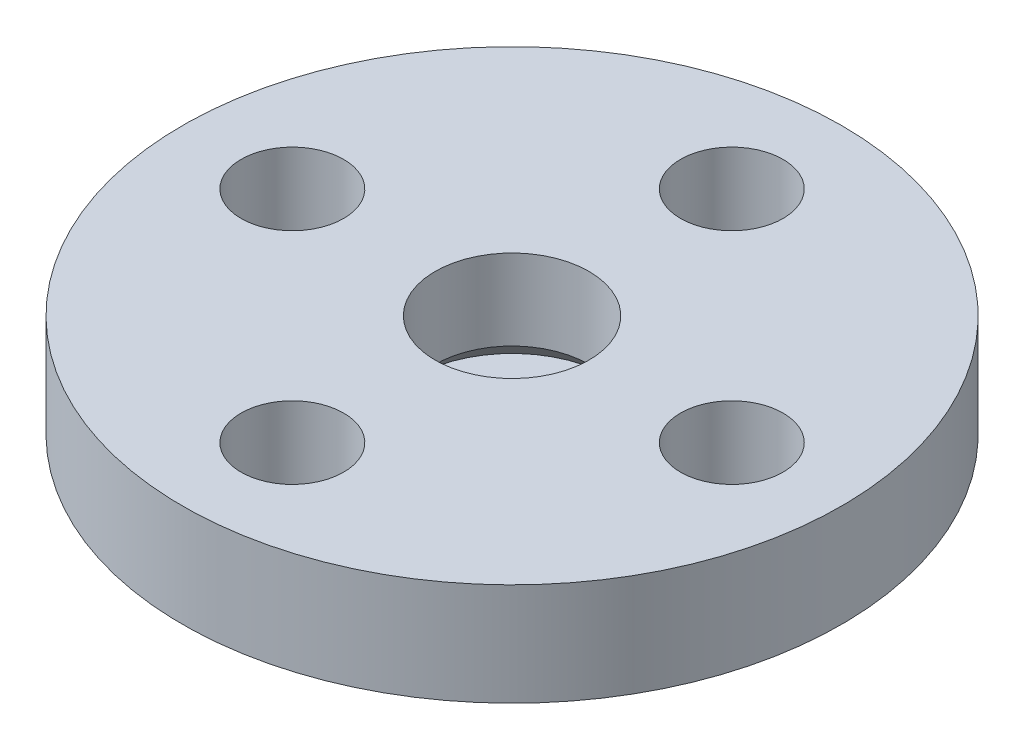
ISO-10303-21;
HEADER;
FILE_DESCRIPTION(('STEP AP214'),'2;1');
FILE_NAME('part.step','',(''),(''),'','','');
FILE_SCHEMA(('AUTOMOTIVE_DESIGN { 1 0 10303 214 1 1 1 1 }'));
ENDSEC;
DATA;
#1=APPLICATION_CONTEXT('core data for automotive mechanical design processes');
#2=APPLICATION_PROTOCOL_DEFINITION('international standard','automotive_design',2000,#1);
#3=PRODUCT_CONTEXT('',#1,'mechanical');
#4=PRODUCT('Part','Part','',(#3));
#5=PRODUCT_RELATED_PRODUCT_CATEGORY('part','',(#4));
#6=PRODUCT_DEFINITION_FORMATION('','',#4);
#7=PRODUCT_DEFINITION_CONTEXT('part definition',#1,'design');
#8=PRODUCT_DEFINITION('design','',#6,#7);
#9=PRODUCT_DEFINITION_SHAPE('','',#8);
#10=(LENGTH_UNIT() NAMED_UNIT(*) SI_UNIT(.MILLI.,.METRE.));
#11=(NAMED_UNIT(*) PLANE_ANGLE_UNIT() SI_UNIT($,.RADIAN.));
#12=(NAMED_UNIT(*) SI_UNIT($,.STERADIAN.) SOLID_ANGLE_UNIT());
#13=UNCERTAINTY_MEASURE_WITH_UNIT(LENGTH_MEASURE(1.E-05),#10,'distance_accuracy_value','');
#14=(GEOMETRIC_REPRESENTATION_CONTEXT(3) GLOBAL_UNCERTAINTY_ASSIGNED_CONTEXT((#13)) GLOBAL_UNIT_ASSIGNED_CONTEXT((#10,
#11,#12)) REPRESENTATION_CONTEXT('',''));
#15=CARTESIAN_POINT('',(0.,0.,0.));
#16=DIRECTION('',(0.,0.,1.));
#17=DIRECTION('',(1.,0.,0.));
#18=AXIS2_PLACEMENT_3D('',#15,#16,#17);
#19=CARTESIAN_POINT('',(0.,0.,-20.));
#20=DIRECTION('',(0.,-1.,0.));
#21=DIRECTION('',(0.,0.,-1.));
#22=AXIS2_PLACEMENT_3D('',#19,#20,#21);
#23=PLANE('',#22);
#24=CARTESIAN_POINT('',(0.,0.,30.));
#25=DIRECTION('',(0.,1.,0.));
#26=DIRECTION('',(0.,0.,-1.));
#27=AXIS2_PLACEMENT_3D('',#24,#25,#26);
#28=CIRCLE('',#27,6.99999999999999);
#29=CARTESIAN_POINT('',(0.,0.,23.));
#30=VERTEX_POINT('',#29);
#31=EDGE_CURVE('E92',#30,#30,#28,.T.);
#32=ORIENTED_EDGE('',*,*,#31,.T.);
#33=EDGE_LOOP('',(#32));
#34=FACE_BOUND('',#33,.T.);
#35=CARTESIAN_POINT('',(0.,0.,-30.));
#36=DIRECTION('',(0.,1.,0.));
#37=DIRECTION('',(0.,0.,1.));
#38=AXIS2_PLACEMENT_3D('',#35,#36,#37);
#39=CIRCLE('',#38,6.99999999999999);
#40=CARTESIAN_POINT('',(0.,0.,-23.));
#41=VERTEX_POINT('',#40);
#42=EDGE_CURVE('E80',#41,#41,#39,.T.);
#43=ORIENTED_EDGE('',*,*,#42,.T.);
#44=EDGE_LOOP('',(#43));
#45=FACE_BOUND('',#44,.T.);
#46=CARTESIAN_POINT('',(0.,0.,0.));
#47=DIRECTION('',(0.,-1.,0.));
#48=DIRECTION('',(0.,0.,-1.));
#49=AXIS2_PLACEMENT_3D('',#46,#47,#48);
#50=CIRCLE('',#49,45.);
#51=CARTESIAN_POINT('',(0.,0.,-45.));
#52=VERTEX_POINT('',#51);
#53=EDGE_CURVE('E64',#52,#52,#50,.T.);
#54=ORIENTED_EDGE('',*,*,#53,.T.);
#55=EDGE_LOOP('',(#54));
#56=FACE_BOUND('',#55,.T.);
#57=CARTESIAN_POINT('',(0.,0.,0.));
#58=DIRECTION('',(0.,-1.,0.));
#59=DIRECTION('',(0.,0.,-1.));
#60=AXIS2_PLACEMENT_3D('',#57,#58,#59);
#61=CIRCLE('',#60,20.);
#62=CARTESIAN_POINT('',(0.,0.,-20.));
#63=VERTEX_POINT('',#62);
#64=EDGE_CURVE('E61',#63,#63,#61,.T.);
#65=ORIENTED_EDGE('',*,*,#64,.F.);
#66=EDGE_LOOP('',(#65));
#67=FACE_BOUND('',#66,.T.);
#68=CARTESIAN_POINT('',(30.,0.,1.04744440165294E-13));
#69=DIRECTION('',(0.,1.,0.));
#70=DIRECTION('',(-1.,0.,0.));
#71=AXIS2_PLACEMENT_3D('',#68,#69,#70);
#72=CIRCLE('',#71,6.99999999999999);
#73=CARTESIAN_POINT('',(23.,0.,0.));
#74=VERTEX_POINT('',#73);
#75=EDGE_CURVE('E86',#74,#74,#72,.T.);
#76=ORIENTED_EDGE('',*,*,#75,.T.);
#77=EDGE_LOOP('',(#76));
#78=FACE_BOUND('',#77,.T.);
#79=CARTESIAN_POINT('',(-30.,0.,-3.14233320495882E-13));
#80=DIRECTION('',(0.,1.,0.));
#81=DIRECTION('',(1.,0.,0.));
#82=AXIS2_PLACEMENT_3D('',#79,#80,#81);
#83=CIRCLE('',#82,6.99999999999999);
#84=CARTESIAN_POINT('',(-23.,0.,-2.40912212380176E-13));
#85=VERTEX_POINT('',#84);
#86=EDGE_CURVE('E98',#85,#85,#83,.T.);
#87=ORIENTED_EDGE('',*,*,#86,.T.);
#88=EDGE_LOOP('',(#87));
#89=FACE_BOUND('',#88,.T.);
#90=ADVANCED_FACE('F38',(#34,#45,#56,#67,#78,#89),#23,.T.);
#91=CARTESIAN_POINT('',(0.,14.,-45.));
#92=DIRECTION('',(0.,1.,0.));
#93=DIRECTION('',(0.,0.,1.));
#94=AXIS2_PLACEMENT_3D('',#91,#92,#93);
#95=PLANE('',#94);
#96=CARTESIAN_POINT('',(0.,14.,30.));
#97=DIRECTION('',(0.,1.,0.));
#98=DIRECTION('',(0.,0.,-1.));
#99=AXIS2_PLACEMENT_3D('',#96,#97,#98);
#100=CIRCLE('',#99,6.99999999999999);
#101=CARTESIAN_POINT('',(0.,14.,23.));
#102=VERTEX_POINT('',#101);
#103=EDGE_CURVE('E89',#102,#102,#100,.T.);
#104=ORIENTED_EDGE('',*,*,#103,.F.);
#105=EDGE_LOOP('',(#104));
#106=FACE_BOUND('',#105,.T.);
#107=CARTESIAN_POINT('',(0.,14.,-30.));
#108=DIRECTION('',(0.,1.,0.));
#109=DIRECTION('',(0.,0.,1.));
#110=AXIS2_PLACEMENT_3D('',#107,#108,#109);
#111=CIRCLE('',#110,6.99999999999999);
#112=CARTESIAN_POINT('',(0.,14.,-23.));
#113=VERTEX_POINT('',#112);
#114=EDGE_CURVE('E79',#113,#113,#111,.T.);
#115=ORIENTED_EDGE('',*,*,#114,.F.);
#116=EDGE_LOOP('',(#115));
#117=FACE_BOUND('',#116,.T.);
#118=CARTESIAN_POINT('',(0.,14.,0.));
#119=DIRECTION('',(0.,-1.,0.));
#120=DIRECTION('',(0.,0.,-1.));
#121=AXIS2_PLACEMENT_3D('',#118,#119,#120);
#122=CIRCLE('',#121,10.5);
#123=CARTESIAN_POINT('',(0.,14.,-10.5));
#124=VERTEX_POINT('',#123);
#125=EDGE_CURVE('E70',#124,#124,#122,.T.);
#126=ORIENTED_EDGE('',*,*,#125,.T.);
#127=EDGE_LOOP('',(#126));
#128=FACE_BOUND('',#127,.T.);
#129=CARTESIAN_POINT('',(0.,14.,0.));
#130=DIRECTION('',(0.,-1.,0.));
#131=DIRECTION('',(0.,0.,-1.));
#132=AXIS2_PLACEMENT_3D('',#129,#130,#131);
#133=CIRCLE('',#132,45.);
#134=CARTESIAN_POINT('',(0.,14.,-45.));
#135=VERTEX_POINT('',#134);
#136=EDGE_CURVE('E67',#135,#135,#133,.T.);
#137=ORIENTED_EDGE('',*,*,#136,.F.);
#138=EDGE_LOOP('',(#137));
#139=FACE_BOUND('',#138,.T.);
#140=CARTESIAN_POINT('',(30.,14.,1.04744440165294E-13));
#141=DIRECTION('',(0.,1.,0.));
#142=DIRECTION('',(-1.,0.,0.));
#143=AXIS2_PLACEMENT_3D('',#140,#141,#142);
#144=CIRCLE('',#143,6.99999999999999);
#145=CARTESIAN_POINT('',(23.,14.,0.));
#146=VERTEX_POINT('',#145);
#147=EDGE_CURVE('E83',#146,#146,#144,.T.);
#148=ORIENTED_EDGE('',*,*,#147,.F.);
#149=EDGE_LOOP('',(#148));
#150=FACE_BOUND('',#149,.T.);
#151=CARTESIAN_POINT('',(-30.,14.,-3.14233320495882E-13));
#152=DIRECTION('',(0.,1.,0.));
#153=DIRECTION('',(1.,0.,0.));
#154=AXIS2_PLACEMENT_3D('',#151,#152,#153);
#155=CIRCLE('',#154,6.99999999999999);
#156=CARTESIAN_POINT('',(-23.,14.,-2.40912212380176E-13));
#157=VERTEX_POINT('',#156);
#158=EDGE_CURVE('E95',#157,#157,#155,.T.);
#159=ORIENTED_EDGE('',*,*,#158,.F.);
#160=EDGE_LOOP('',(#159));
#161=FACE_BOUND('',#160,.T.);
#162=ADVANCED_FACE('F107',(#106,#117,#128,#139,#150,#161),#95,.T.);
#163=CARTESIAN_POINT('',(0.,0.,-13.5));
#164=DIRECTION('',(0.,1.,0.));
#165=DIRECTION('',(0.,0.,1.));
#166=AXIS2_PLACEMENT_3D('',#163,#164,#165);
#167=PLANE('',#166);
#168=CARTESIAN_POINT('',(0.,0.,0.));
#169=DIRECTION('',(0.,-1.,0.));
#170=DIRECTION('',(0.,0.,-1.));
#171=AXIS2_PLACEMENT_3D('',#168,#169,#170);
#172=CIRCLE('',#171,9.);
#173=CARTESIAN_POINT('',(0.,0.,-9.));
#174=VERTEX_POINT('',#173);
#175=EDGE_CURVE('E10',#174,#174,#172,.T.);
#176=ORIENTED_EDGE('',*,*,#175,.T.);
#177=EDGE_LOOP('',(#176));
#178=FACE_BOUND('',#177,.T.);
#179=CARTESIAN_POINT('',(0.,0.,0.));
#180=DIRECTION('',(0.,-1.,0.));
#181=DIRECTION('',(0.,0.,-1.));
#182=AXIS2_PLACEMENT_3D('',#179,#180,#181);
#183=CIRCLE('',#182,13.5);
#184=CARTESIAN_POINT('',(0.,0.,-13.5));
#185=VERTEX_POINT('',#184);
#186=EDGE_CURVE('E76',#185,#185,#183,.T.);
#187=ORIENTED_EDGE('',*,*,#186,.F.);
#188=EDGE_LOOP('',(#187));
#189=FACE_BOUND('',#188,.T.);
#190=ADVANCED_FACE('F40',(#178,#189),#167,.T.);
#191=CARTESIAN_POINT('',(0.,0.,0.));
#192=DIRECTION('',(0.,-1.,0.));
#193=DIRECTION('',(0.,0.,-1.));
#194=AXIS2_PLACEMENT_3D('',#191,#192,#193);
#195=CYLINDRICAL_SURFACE('',#194,9.);
#196=CARTESIAN_POINT('',(0.,-7.5,0.));
#197=DIRECTION('',(0.,-1.,0.));
#198=DIRECTION('',(0.,0.,-1.));
#199=AXIS2_PLACEMENT_3D('',#196,#197,#198);
#200=CIRCLE('',#199,9.);
#201=CARTESIAN_POINT('',(0.,-7.5,-9.));
#202=VERTEX_POINT('',#201);
#203=EDGE_CURVE('E45',#202,#202,#200,.T.);
#204=ORIENTED_EDGE('',*,*,#203,.T.);
#205=EDGE_LOOP('',(#204));
#206=FACE_BOUND('',#205,.T.);
#207=ORIENTED_EDGE('',*,*,#175,.F.);
#208=EDGE_LOOP('',(#207));
#209=FACE_BOUND('',#208,.T.);
#210=ADVANCED_FACE('F116',(#206,#209),#195,.F.);
#211=CARTESIAN_POINT('',(0.,-7.5,-9.));
#212=DIRECTION('',(0.,-1.,0.));
#213=DIRECTION('',(0.,0.,-1.));
#214=AXIS2_PLACEMENT_3D('',#211,#212,#213);
#215=PLANE('',#214);
#216=CARTESIAN_POINT('',(0.,-7.5,0.));
#217=DIRECTION('',(0.,-1.,0.));
#218=DIRECTION('',(0.,0.,-1.));
#219=AXIS2_PLACEMENT_3D('',#216,#217,#218);
#220=CIRCLE('',#219,12.);
#221=CARTESIAN_POINT('',(0.,-7.5,-12.));
#222=VERTEX_POINT('',#221);
#223=EDGE_CURVE('E49',#222,#222,#220,.T.);
#224=ORIENTED_EDGE('',*,*,#223,.T.);
#225=EDGE_LOOP('',(#224));
#226=FACE_BOUND('',#225,.T.);
#227=ORIENTED_EDGE('',*,*,#203,.F.);
#228=EDGE_LOOP('',(#227));
#229=FACE_BOUND('',#228,.T.);
#230=ADVANCED_FACE('F140',(#226,#229),#215,.T.);
#231=CARTESIAN_POINT('',(0.,0.,0.));
#232=DIRECTION('',(0.,-1.,0.));
#233=DIRECTION('',(0.,0.,-1.));
#234=AXIS2_PLACEMENT_3D('',#231,#232,#233);
#235=CYLINDRICAL_SURFACE('',#234,12.);
#236=CARTESIAN_POINT('',(0.,-12.,0.));
#237=DIRECTION('',(0.,-1.,0.));
#238=DIRECTION('',(0.,0.,-1.));
#239=AXIS2_PLACEMENT_3D('',#236,#237,#238);
#240=CIRCLE('',#239,12.);
#241=CARTESIAN_POINT('',(0.,-12.,-12.));
#242=VERTEX_POINT('',#241);
#243=EDGE_CURVE('E53',#242,#242,#240,.T.);
#244=ORIENTED_EDGE('',*,*,#243,.T.);
#245=EDGE_LOOP('',(#244));
#246=FACE_BOUND('',#245,.T.);
#247=ORIENTED_EDGE('',*,*,#223,.F.);
#248=EDGE_LOOP('',(#247));
#249=FACE_BOUND('',#248,.T.);
#250=ADVANCED_FACE('F136',(#246,#249),#235,.F.);
#251=CARTESIAN_POINT('',(0.,-12.,-12.));
#252=DIRECTION('',(0.,-1.,0.));
#253=DIRECTION('',(0.,0.,-1.));
#254=AXIS2_PLACEMENT_3D('',#251,#252,#253);
#255=PLANE('',#254);
#256=CARTESIAN_POINT('',(0.,-12.,0.));
#257=DIRECTION('',(0.,-1.,0.));
#258=DIRECTION('',(0.,0.,-1.));
#259=AXIS2_PLACEMENT_3D('',#256,#257,#258);
#260=CIRCLE('',#259,20.);
#261=CARTESIAN_POINT('',(0.,-12.,-20.));
#262=VERTEX_POINT('',#261);
#263=EDGE_CURVE('E58',#262,#262,#260,.T.);
#264=ORIENTED_EDGE('',*,*,#263,.T.);
#265=EDGE_LOOP('',(#264));
#266=FACE_BOUND('',#265,.T.);
#267=ORIENTED_EDGE('',*,*,#243,.F.);
#268=EDGE_LOOP('',(#267));
#269=FACE_BOUND('',#268,.T.);
#270=ADVANCED_FACE('F132',(#266,#269),#255,.T.);
#271=CARTESIAN_POINT('',(0.,0.,0.));
#272=DIRECTION('',(0.,-1.,0.));
#273=DIRECTION('',(0.,0.,-1.));
#274=AXIS2_PLACEMENT_3D('',#271,#272,#273);
#275=CYLINDRICAL_SURFACE('',#274,20.);
#276=ORIENTED_EDGE('',*,*,#64,.T.);
#277=EDGE_LOOP('',(#276));
#278=FACE_BOUND('',#277,.T.);
#279=ORIENTED_EDGE('',*,*,#263,.F.);
#280=EDGE_LOOP('',(#279));
#281=FACE_BOUND('',#280,.T.);
#282=ADVANCED_FACE('F127',(#278,#281),#275,.T.);
#283=CARTESIAN_POINT('',(0.,0.,0.));
#284=DIRECTION('',(0.,-1.,0.));
#285=DIRECTION('',(0.,0.,-1.));
#286=AXIS2_PLACEMENT_3D('',#283,#284,#285);
#287=CYLINDRICAL_SURFACE('',#286,45.);
#288=ORIENTED_EDGE('',*,*,#136,.T.);
#289=EDGE_LOOP('',(#288));
#290=FACE_BOUND('',#289,.T.);
#291=ORIENTED_EDGE('',*,*,#53,.F.);
#292=EDGE_LOOP('',(#291));
#293=FACE_BOUND('',#292,.T.);
#294=ADVANCED_FACE('F125',(#290,#293),#287,.T.);
#295=CARTESIAN_POINT('',(0.,0.,0.));
#296=DIRECTION('',(0.,-1.,0.));
#297=DIRECTION('',(0.,0.,-1.));
#298=AXIS2_PLACEMENT_3D('',#295,#296,#297);
#299=CYLINDRICAL_SURFACE('',#298,10.5);
#300=CARTESIAN_POINT('',(0.,3.,0.));
#301=DIRECTION('',(0.,-1.,0.));
#302=DIRECTION('',(0.,0.,-1.));
#303=AXIS2_PLACEMENT_3D('',#300,#301,#302);
#304=CIRCLE('',#303,10.5);
#305=CARTESIAN_POINT('',(0.,3.,-10.5));
#306=VERTEX_POINT('',#305);
#307=EDGE_CURVE('E73',#306,#306,#304,.T.);
#308=ORIENTED_EDGE('',*,*,#307,.T.);
#309=EDGE_LOOP('',(#308));
#310=FACE_BOUND('',#309,.T.);
#311=ORIENTED_EDGE('',*,*,#125,.F.);
#312=EDGE_LOOP('',(#311));
#313=FACE_BOUND('',#312,.T.);
#314=ADVANCED_FACE('F123',(#310,#313),#299,.F.);
#315=CARTESIAN_POINT('',(0.,3.,0.));
#316=DIRECTION('',(0.,-1.,0.));
#317=DIRECTION('',(0.,0.,-1.));
#318=AXIS2_PLACEMENT_3D('',#315,#316,#317);
#319=CONICAL_SURFACE('',#318,10.5,0.78539816339745);
#320=ORIENTED_EDGE('',*,*,#186,.T.);
#321=EDGE_LOOP('',(#320));
#322=FACE_BOUND('',#321,.T.);
#323=ORIENTED_EDGE('',*,*,#307,.F.);
#324=EDGE_LOOP('',(#323));
#325=FACE_BOUND('',#324,.T.);
#326=ADVANCED_FACE('F182',(#322,#325),#319,.F.);
#327=CARTESIAN_POINT('',(0.,14.,-30.));
#328=DIRECTION('',(0.,-1.,0.));
#329=DIRECTION('',(0.,0.,-1.));
#330=AXIS2_PLACEMENT_3D('',#327,#328,#329);
#331=CYLINDRICAL_SURFACE('',#330,6.99999999999999);
#332=ORIENTED_EDGE('',*,*,#114,.T.);
#333=EDGE_LOOP('',(#332));
#334=FACE_BOUND('',#333,.T.);
#335=ORIENTED_EDGE('',*,*,#42,.F.);
#336=EDGE_LOOP('',(#335));
#337=FACE_BOUND('',#336,.T.);
#338=ADVANCED_FACE('F190',(#334,#337),#331,.F.);
#339=CARTESIAN_POINT('',(30.,14.,1.04744440165294E-13));
#340=DIRECTION('',(0.,-1.,0.));
#341=DIRECTION('',(0.,0.,-1.));
#342=AXIS2_PLACEMENT_3D('',#339,#340,#341);
#343=CYLINDRICAL_SURFACE('',#342,6.99999999999999);
#344=ORIENTED_EDGE('',*,*,#147,.T.);
#345=EDGE_LOOP('',(#344));
#346=FACE_BOUND('',#345,.T.);
#347=ORIENTED_EDGE('',*,*,#75,.F.);
#348=EDGE_LOOP('',(#347));
#349=FACE_BOUND('',#348,.T.);
#350=ADVANCED_FACE('F197',(#346,#349),#343,.F.);
#351=CARTESIAN_POINT('',(0.,14.,30.));
#352=DIRECTION('',(0.,-1.,0.));
#353=DIRECTION('',(0.,0.,-1.));
#354=AXIS2_PLACEMENT_3D('',#351,#352,#353);
#355=CYLINDRICAL_SURFACE('',#354,6.99999999999999);
#356=ORIENTED_EDGE('',*,*,#103,.T.);
#357=EDGE_LOOP('',(#356));
#358=FACE_BOUND('',#357,.T.);
#359=ORIENTED_EDGE('',*,*,#31,.F.);
#360=EDGE_LOOP('',(#359));
#361=FACE_BOUND('',#360,.T.);
#362=ADVANCED_FACE('F217',(#358,#361),#355,.F.);
#363=CARTESIAN_POINT('',(-30.,14.,-3.14233320495882E-13));
#364=DIRECTION('',(0.,-1.,0.));
#365=DIRECTION('',(0.,0.,-1.));
#366=AXIS2_PLACEMENT_3D('',#363,#364,#365);
#367=CYLINDRICAL_SURFACE('',#366,6.99999999999999);
#368=ORIENTED_EDGE('',*,*,#158,.T.);
#369=EDGE_LOOP('',(#368));
#370=FACE_BOUND('',#369,.T.);
#371=ORIENTED_EDGE('',*,*,#86,.F.);
#372=EDGE_LOOP('',(#371));
#373=FACE_BOUND('',#372,.T.);
#374=ADVANCED_FACE('F104',(#370,#373),#367,.F.);
#375=CLOSED_SHELL('',(#90,#162,#190,#210,#230,#250,#270,#282,#294,#314,#326,#338,#350,#362,#374));
#376=MANIFOLD_SOLID_BREP('B2',#375);
#377=ADVANCED_BREP_SHAPE_REPRESENTATION('',(#18,#376),#14);
#378=SHAPE_DEFINITION_REPRESENTATION(#9,#377);
ENDSEC;
END-ISO-10303-21;
